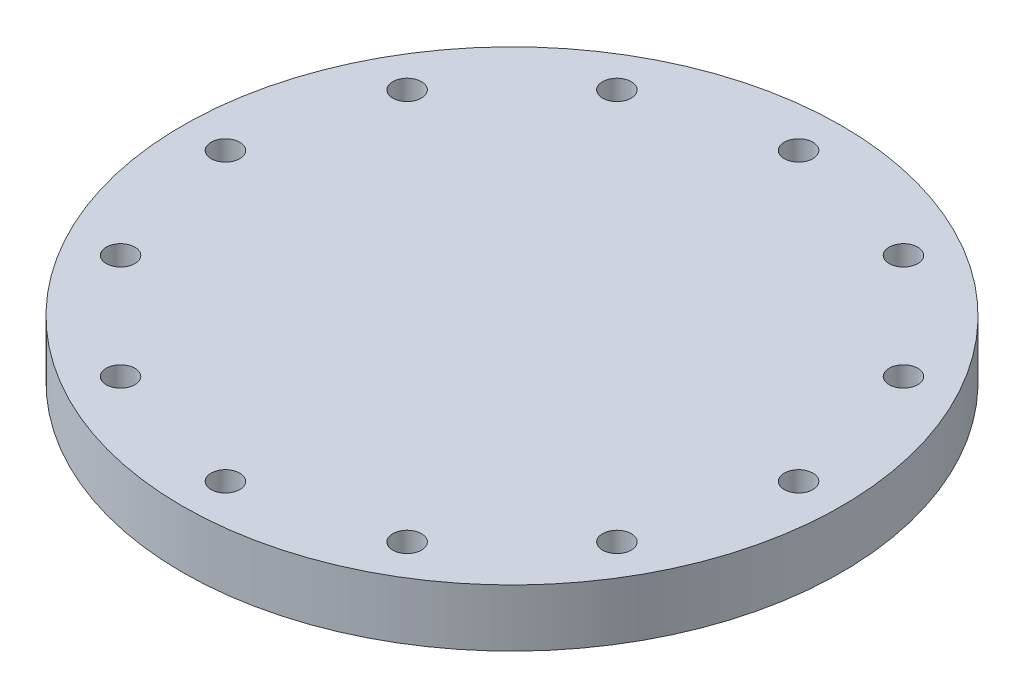
ISO-10303-21;
HEADER;
FILE_DESCRIPTION(('STEP AP214'),'2;1');
FILE_NAME('part.step','',(''),(''),'','','');
FILE_SCHEMA(('AUTOMOTIVE_DESIGN { 1 0 10303 214 1 1 1 1 }'));
ENDSEC;
DATA;
#1=APPLICATION_CONTEXT('core data for automotive mechanical design processes');
#2=APPLICATION_PROTOCOL_DEFINITION('international standard','automotive_design',2000,#1);
#3=PRODUCT_CONTEXT('',#1,'mechanical');
#4=PRODUCT('Part','Part','',(#3));
#5=PRODUCT_RELATED_PRODUCT_CATEGORY('part','',(#4));
#6=PRODUCT_DEFINITION_FORMATION('','',#4);
#7=PRODUCT_DEFINITION_CONTEXT('part definition',#1,'design');
#8=PRODUCT_DEFINITION('design','',#6,#7);
#9=PRODUCT_DEFINITION_SHAPE('','',#8);
#10=(LENGTH_UNIT() NAMED_UNIT(*) SI_UNIT(.MILLI.,.METRE.));
#11=(NAMED_UNIT(*) PLANE_ANGLE_UNIT() SI_UNIT($,.RADIAN.));
#12=(NAMED_UNIT(*) SI_UNIT($,.STERADIAN.) SOLID_ANGLE_UNIT());
#13=UNCERTAINTY_MEASURE_WITH_UNIT(LENGTH_MEASURE(1.E-05),#10,'distance_accuracy_value','');
#14=(GEOMETRIC_REPRESENTATION_CONTEXT(3) GLOBAL_UNCERTAINTY_ASSIGNED_CONTEXT((#13)) GLOBAL_UNIT_ASSIGNED_CONTEXT((#10,
#11,#12)) REPRESENTATION_CONTEXT('',''));
#15=CARTESIAN_POINT('',(0.,0.,0.));
#16=DIRECTION('',(0.,0.,1.));
#17=DIRECTION('',(1.,0.,0.));
#18=AXIS2_PLACEMENT_3D('',#15,#16,#17);
#19=CARTESIAN_POINT('',(0.,20.,0.));
#20=DIRECTION('',(0.,-1.,0.));
#21=DIRECTION('',(0.,0.,-1.));
#22=AXIS2_PLACEMENT_3D('',#19,#20,#21);
#23=CYLINDRICAL_SURFACE('',#22,115.);
#24=CARTESIAN_POINT('',(0.,20.,0.));
#25=DIRECTION('',(0.,1.,0.));
#26=DIRECTION('',(0.,0.,1.));
#27=AXIS2_PLACEMENT_3D('',#24,#25,#26);
#28=CIRCLE('',#27,115.);
#29=CARTESIAN_POINT('',(0.,20.,115.));
#30=VERTEX_POINT('',#29);
#31=EDGE_CURVE('E10',#30,#30,#28,.T.);
#32=ORIENTED_EDGE('',*,*,#31,.F.);
#33=EDGE_LOOP('',(#32));
#34=FACE_BOUND('',#33,.T.);
#35=CARTESIAN_POINT('',(0.,0.,0.));
#36=DIRECTION('',(0.,1.,0.));
#37=DIRECTION('',(0.,0.,1.));
#38=AXIS2_PLACEMENT_3D('',#35,#36,#37);
#39=CIRCLE('',#38,115.);
#40=CARTESIAN_POINT('',(0.,0.,115.));
#41=VERTEX_POINT('',#40);
#42=EDGE_CURVE('E40',#41,#41,#39,.T.);
#43=ORIENTED_EDGE('',*,*,#42,.T.);
#44=EDGE_LOOP('',(#43));
#45=FACE_BOUND('',#44,.T.);
#46=ADVANCED_FACE('F37',(#34,#45),#23,.T.);
#47=CARTESIAN_POINT('',(0.,20.,0.));
#48=DIRECTION('',(0.,1.,0.));
#49=DIRECTION('',(0.,0.,1.));
#50=AXIS2_PLACEMENT_3D('',#47,#48,#49);
#51=PLANE('',#50);
#52=CARTESIAN_POINT('',(0.,20.,-100.));
#53=DIRECTION('',(0.,1.,0.));
#54=DIRECTION('',(0.,0.,1.));
#55=AXIS2_PLACEMENT_3D('',#52,#53,#54);
#56=CIRCLE('',#55,5.);
#57=CARTESIAN_POINT('',(0.,20.,-95.));
#58=VERTEX_POINT('',#57);
#59=EDGE_CURVE('E81',#58,#58,#56,.T.);
#60=ORIENTED_EDGE('',*,*,#59,.F.);
#61=EDGE_LOOP('',(#60));
#62=FACE_BOUND('',#61,.T.);
#63=CARTESIAN_POINT('',(-49.9999999999995,20.,-86.6025403784416));
#64=DIRECTION('',(0.,1.,0.));
#65=DIRECTION('',(0.,0.,1.));
#66=AXIS2_PLACEMENT_3D('',#63,#64,#65);
#67=CIRCLE('',#66,5.);
#68=CARTESIAN_POINT('',(-49.9999999999995,20.,-81.6025403784416));
#69=VERTEX_POINT('',#68);
#70=EDGE_CURVE('E122',#69,#69,#67,.T.);
#71=ORIENTED_EDGE('',*,*,#70,.F.);
#72=EDGE_LOOP('',(#71));
#73=FACE_BOUND('',#72,.T.);
#74=CARTESIAN_POINT('',(-86.6025403784417,20.,-49.9999999999961));
#75=DIRECTION('',(0.,1.,0.));
#76=DIRECTION('',(0.,0.,1.));
#77=AXIS2_PLACEMENT_3D('',#74,#75,#76);
#78=CIRCLE('',#77,5.00000000000001);
#79=CARTESIAN_POINT('',(-86.6025403784417,20.,-44.9999999999961));
#80=VERTEX_POINT('',#79);
#81=EDGE_CURVE('E121',#80,#80,#78,.T.);
#82=ORIENTED_EDGE('',*,*,#81,.F.);
#83=EDGE_LOOP('',(#82));
#84=FACE_BOUND('',#83,.T.);
#85=CARTESIAN_POINT('',(-99.9999999999956,20.,4.47550075018927E-12));
#86=DIRECTION('',(0.,1.,0.));
#87=DIRECTION('',(0.,0.,1.));
#88=AXIS2_PLACEMENT_3D('',#85,#86,#87);
#89=CIRCLE('',#88,5.);
#90=CARTESIAN_POINT('',(-99.9999999999956,20.,5.00000000000448));
#91=VERTEX_POINT('',#90);
#92=EDGE_CURVE('E130',#91,#91,#89,.T.);
#93=ORIENTED_EDGE('',*,*,#92,.F.);
#94=EDGE_LOOP('',(#93));
#95=FACE_BOUND('',#94,.T.);
#96=CARTESIAN_POINT('',(50.0000000000006,20.,-86.6025403784461));
#97=DIRECTION('',(0.,1.,0.));
#98=DIRECTION('',(0.,0.,1.));
#99=AXIS2_PLACEMENT_3D('',#96,#97,#98);
#100=CIRCLE('',#99,5.);
#101=CARTESIAN_POINT('',(50.0000000000006,20.,-81.6025403784461));
#102=VERTEX_POINT('',#101);
#103=EDGE_CURVE('E73',#102,#102,#100,.T.);
#104=ORIENTED_EDGE('',*,*,#103,.F.);
#105=EDGE_LOOP('',(#104));
#106=FACE_BOUND('',#105,.T.);
#107=CARTESIAN_POINT('',(86.6025403784461,20.,-50.0000000000039));
#108=DIRECTION('',(0.,1.,0.));
#109=DIRECTION('',(0.,0.,1.));
#110=AXIS2_PLACEMENT_3D('',#107,#108,#109);
#111=CIRCLE('',#110,5.00000000000001);
#112=CARTESIAN_POINT('',(86.6025403784461,20.,-45.0000000000039));
#113=VERTEX_POINT('',#112);
#114=EDGE_CURVE('E65',#113,#113,#111,.T.);
#115=ORIENTED_EDGE('',*,*,#114,.F.);
#116=EDGE_LOOP('',(#115));
#117=FACE_BOUND('',#116,.T.);
#118=CARTESIAN_POINT('',(100.000000000004,20.,-4.4632542821978E-12));
#119=DIRECTION('',(0.,1.,0.));
#120=DIRECTION('',(0.,0.,1.));
#121=AXIS2_PLACEMENT_3D('',#118,#119,#120);
#122=CIRCLE('',#121,5.);
#123=CARTESIAN_POINT('',(100.000000000004,20.,4.99999999999554));
#124=VERTEX_POINT('',#123);
#125=EDGE_CURVE('E55',#124,#124,#122,.T.);
#126=ORIENTED_EDGE('',*,*,#125,.F.);
#127=EDGE_LOOP('',(#126));
#128=FACE_BOUND('',#127,.T.);
#129=CARTESIAN_POINT('',(86.6025403784506,20.,49.9999999999961));
#130=DIRECTION('',(0.,1.,0.));
#131=DIRECTION('',(0.,0.,1.));
#132=AXIS2_PLACEMENT_3D('',#129,#130,#131);
#133=CIRCLE('',#132,5.00000000000001);
#134=CARTESIAN_POINT('',(86.6025403784506,20.,54.9999999999961));
#135=VERTEX_POINT('',#134);
#136=EDGE_CURVE('E56',#135,#135,#133,.T.);
#137=ORIENTED_EDGE('',*,*,#136,.F.);
#138=EDGE_LOOP('',(#137));
#139=FACE_BOUND('',#138,.T.);
#140=CARTESIAN_POINT('',(50.0000000000083,20.,86.6025403784416));
#141=DIRECTION('',(0.,1.,0.));
#142=DIRECTION('',(0.,0.,1.));
#143=AXIS2_PLACEMENT_3D('',#140,#141,#142);
#144=CIRCLE('',#143,5.);
#145=CARTESIAN_POINT('',(50.0000000000083,20.,91.6025403784416));
#146=VERTEX_POINT('',#145);
#147=EDGE_CURVE('E107',#146,#146,#144,.T.);
#148=ORIENTED_EDGE('',*,*,#147,.F.);
#149=EDGE_LOOP('',(#148));
#150=FACE_BOUND('',#149,.T.);
#151=CARTESIAN_POINT('',(8.92650856439559E-12,20.,100.));
#152=DIRECTION('',(0.,1.,0.));
#153=DIRECTION('',(0.,0.,1.));
#154=AXIS2_PLACEMENT_3D('',#151,#152,#153);
#155=CIRCLE('',#154,5.);
#156=CARTESIAN_POINT('',(8.92650856439559E-12,20.,105.));
#157=VERTEX_POINT('',#156);
#158=EDGE_CURVE('E99',#157,#157,#155,.T.);
#159=ORIENTED_EDGE('',*,*,#158,.F.);
#160=EDGE_LOOP('',(#159));
#161=FACE_BOUND('',#160,.T.);
#162=CARTESIAN_POINT('',(-49.9999999999917,20.,86.6025403784461));
#163=DIRECTION('',(0.,1.,0.));
#164=DIRECTION('',(0.,0.,1.));
#165=AXIS2_PLACEMENT_3D('',#162,#163,#164);
#166=CIRCLE('',#165,5.);
#167=CARTESIAN_POINT('',(-49.9999999999917,20.,91.6025403784461));
#168=VERTEX_POINT('',#167);
#169=EDGE_CURVE('E89',#168,#168,#166,.T.);
#170=ORIENTED_EDGE('',*,*,#169,.F.);
#171=EDGE_LOOP('',(#170));
#172=FACE_BOUND('',#171,.T.);
#173=CARTESIAN_POINT('',(-86.6025403784372,20.,50.0000000000039));
#174=DIRECTION('',(0.,1.,0.));
#175=DIRECTION('',(0.,0.,1.));
#176=AXIS2_PLACEMENT_3D('',#173,#174,#175);
#177=CIRCLE('',#176,5.00000000000001);
#178=CARTESIAN_POINT('',(-86.6025403784372,20.,55.0000000000039));
#179=VERTEX_POINT('',#178);
#180=EDGE_CURVE('E90',#179,#179,#177,.T.);
#181=ORIENTED_EDGE('',*,*,#180,.F.);
#182=EDGE_LOOP('',(#181));
#183=FACE_BOUND('',#182,.T.);
#184=ORIENTED_EDGE('',*,*,#31,.T.);
#185=EDGE_LOOP('',(#184));
#186=FACE_BOUND('',#185,.T.);
#187=ADVANCED_FACE('F150',(#62,#73,#84,#95,#106,#117,#128,#139,#150,#161,#172,#183,#186),#51,.T.);
#188=CARTESIAN_POINT('',(0.,0.,0.));
#189=DIRECTION('',(0.,1.,0.));
#190=DIRECTION('',(0.,0.,1.));
#191=AXIS2_PLACEMENT_3D('',#188,#189,#190);
#192=PLANE('',#191);
#193=CARTESIAN_POINT('',(0.,0.,-100.));
#194=DIRECTION('',(0.,1.,0.));
#195=DIRECTION('',(0.,0.,1.));
#196=AXIS2_PLACEMENT_3D('',#193,#194,#195);
#197=CIRCLE('',#196,5.);
#198=CARTESIAN_POINT('',(0.,0.,-95.));
#199=VERTEX_POINT('',#198);
#200=EDGE_CURVE('E49',#199,#199,#197,.F.);
#201=ORIENTED_EDGE('',*,*,#200,.F.);
#202=EDGE_LOOP('',(#201));
#203=FACE_BOUND('',#202,.T.);
#204=CARTESIAN_POINT('',(-49.9999999999995,0.,-86.6025403784416));
#205=DIRECTION('',(0.,1.,0.));
#206=DIRECTION('',(0.,0.,1.));
#207=AXIS2_PLACEMENT_3D('',#204,#205,#206);
#208=CIRCLE('',#207,5.);
#209=CARTESIAN_POINT('',(-49.9999999999995,0.,-81.6025403784416));
#210=VERTEX_POINT('',#209);
#211=EDGE_CURVE('E117',#210,#210,#208,.F.);
#212=ORIENTED_EDGE('',*,*,#211,.F.);
#213=EDGE_LOOP('',(#212));
#214=FACE_BOUND('',#213,.T.);
#215=CARTESIAN_POINT('',(-86.6025403784417,0.,-49.9999999999961));
#216=DIRECTION('',(0.,1.,0.));
#217=DIRECTION('',(0.,0.,1.));
#218=AXIS2_PLACEMENT_3D('',#215,#216,#217);
#219=CIRCLE('',#218,5.00000000000001);
#220=CARTESIAN_POINT('',(-86.6025403784417,0.,-44.9999999999961));
#221=VERTEX_POINT('',#220);
#222=EDGE_CURVE('E126',#221,#221,#219,.F.);
#223=ORIENTED_EDGE('',*,*,#222,.F.);
#224=EDGE_LOOP('',(#223));
#225=FACE_BOUND('',#224,.T.);
#226=CARTESIAN_POINT('',(-99.9999999999956,0.,4.47550075018927E-12));
#227=DIRECTION('',(0.,1.,0.));
#228=DIRECTION('',(0.,0.,1.));
#229=AXIS2_PLACEMENT_3D('',#226,#227,#228);
#230=CIRCLE('',#229,5.);
#231=CARTESIAN_POINT('',(-99.9999999999956,0.,5.00000000000448));
#232=VERTEX_POINT('',#231);
#233=EDGE_CURVE('E94',#232,#232,#230,.F.);
#234=ORIENTED_EDGE('',*,*,#233,.F.);
#235=EDGE_LOOP('',(#234));
#236=FACE_BOUND('',#235,.T.);
#237=CARTESIAN_POINT('',(50.0000000000006,0.,-86.6025403784461));
#238=DIRECTION('',(0.,1.,0.));
#239=DIRECTION('',(0.,0.,1.));
#240=AXIS2_PLACEMENT_3D('',#237,#238,#239);
#241=CIRCLE('',#240,5.);
#242=CARTESIAN_POINT('',(50.0000000000006,0.,-81.6025403784461));
#243=VERTEX_POINT('',#242);
#244=EDGE_CURVE('E77',#243,#243,#241,.F.);
#245=ORIENTED_EDGE('',*,*,#244,.F.);
#246=EDGE_LOOP('',(#245));
#247=FACE_BOUND('',#246,.T.);
#248=CARTESIAN_POINT('',(86.6025403784461,0.,-50.0000000000039));
#249=DIRECTION('',(0.,1.,0.));
#250=DIRECTION('',(0.,0.,1.));
#251=AXIS2_PLACEMENT_3D('',#248,#249,#250);
#252=CIRCLE('',#251,5.00000000000001);
#253=CARTESIAN_POINT('',(86.6025403784461,0.,-45.0000000000039));
#254=VERTEX_POINT('',#253);
#255=EDGE_CURVE('E69',#254,#254,#252,.F.);
#256=ORIENTED_EDGE('',*,*,#255,.F.);
#257=EDGE_LOOP('',(#256));
#258=FACE_BOUND('',#257,.T.);
#259=CARTESIAN_POINT('',(100.000000000004,0.,-4.4632542821978E-12));
#260=DIRECTION('',(0.,1.,0.));
#261=DIRECTION('',(0.,0.,1.));
#262=AXIS2_PLACEMENT_3D('',#259,#260,#261);
#263=CIRCLE('',#262,5.);
#264=CARTESIAN_POINT('',(100.000000000004,0.,4.99999999999554));
#265=VERTEX_POINT('',#264);
#266=EDGE_CURVE('E61',#265,#265,#263,.F.);
#267=ORIENTED_EDGE('',*,*,#266,.F.);
#268=EDGE_LOOP('',(#267));
#269=FACE_BOUND('',#268,.T.);
#270=CARTESIAN_POINT('',(86.6025403784506,0.,49.9999999999961));
#271=DIRECTION('',(0.,1.,0.));
#272=DIRECTION('',(0.,0.,1.));
#273=AXIS2_PLACEMENT_3D('',#270,#271,#272);
#274=CIRCLE('',#273,5.00000000000001);
#275=CARTESIAN_POINT('',(86.6025403784506,0.,54.9999999999961));
#276=VERTEX_POINT('',#275);
#277=EDGE_CURVE('E51',#276,#276,#274,.F.);
#278=ORIENTED_EDGE('',*,*,#277,.F.);
#279=EDGE_LOOP('',(#278));
#280=FACE_BOUND('',#279,.T.);
#281=CARTESIAN_POINT('',(50.0000000000083,0.,86.6025403784416));
#282=DIRECTION('',(0.,1.,0.));
#283=DIRECTION('',(0.,0.,1.));
#284=AXIS2_PLACEMENT_3D('',#281,#282,#283);
#285=CIRCLE('',#284,5.);
#286=CARTESIAN_POINT('',(50.0000000000083,0.,91.6025403784416));
#287=VERTEX_POINT('',#286);
#288=EDGE_CURVE('E60',#287,#287,#285,.F.);
#289=ORIENTED_EDGE('',*,*,#288,.F.);
#290=EDGE_LOOP('',(#289));
#291=FACE_BOUND('',#290,.T.);
#292=CARTESIAN_POINT('',(8.92650856439559E-12,0.,100.));
#293=DIRECTION('',(0.,1.,0.));
#294=DIRECTION('',(0.,0.,1.));
#295=AXIS2_PLACEMENT_3D('',#292,#293,#294);
#296=CIRCLE('',#295,5.);
#297=CARTESIAN_POINT('',(8.92650856439559E-12,0.,105.));
#298=VERTEX_POINT('',#297);
#299=EDGE_CURVE('E103',#298,#298,#296,.F.);
#300=ORIENTED_EDGE('',*,*,#299,.F.);
#301=EDGE_LOOP('',(#300));
#302=FACE_BOUND('',#301,.T.);
#303=CARTESIAN_POINT('',(-49.9999999999917,0.,86.6025403784461));
#304=DIRECTION('',(0.,1.,0.));
#305=DIRECTION('',(0.,0.,1.));
#306=AXIS2_PLACEMENT_3D('',#303,#304,#305);
#307=CIRCLE('',#306,5.);
#308=CARTESIAN_POINT('',(-49.9999999999917,0.,91.6025403784461));
#309=VERTEX_POINT('',#308);
#310=EDGE_CURVE('E95',#309,#309,#307,.F.);
#311=ORIENTED_EDGE('',*,*,#310,.F.);
#312=EDGE_LOOP('',(#311));
#313=FACE_BOUND('',#312,.T.);
#314=CARTESIAN_POINT('',(-86.6025403784372,0.,50.0000000000039));
#315=DIRECTION('',(0.,1.,0.));
#316=DIRECTION('',(0.,0.,1.));
#317=AXIS2_PLACEMENT_3D('',#314,#315,#316);
#318=CIRCLE('',#317,5.00000000000001);
#319=CARTESIAN_POINT('',(-86.6025403784372,0.,55.0000000000039));
#320=VERTEX_POINT('',#319);
#321=EDGE_CURVE('E85',#320,#320,#318,.F.);
#322=ORIENTED_EDGE('',*,*,#321,.F.);
#323=EDGE_LOOP('',(#322));
#324=FACE_BOUND('',#323,.T.);
#325=ORIENTED_EDGE('',*,*,#42,.F.);
#326=EDGE_LOOP('',(#325));
#327=FACE_BOUND('',#326,.T.);
#328=ADVANCED_FACE('F153',(#203,#214,#225,#236,#247,#258,#269,#280,#291,#302,#313,#324,#327),
#192,.F.);
#329=CARTESIAN_POINT('',(-86.6025403784372,-0.001000000000001,50.0000000000039));
#330=DIRECTION('',(0.,1.,0.));
#331=DIRECTION('',(0.,0.,1.));
#332=AXIS2_PLACEMENT_3D('',#329,#330,#331);
#333=CYLINDRICAL_SURFACE('',#332,5.00000000000001);
#334=ORIENTED_EDGE('',*,*,#180,.T.);
#335=EDGE_LOOP('',(#334));
#336=FACE_BOUND('',#335,.T.);
#337=ORIENTED_EDGE('',*,*,#321,.T.);
#338=EDGE_LOOP('',(#337));
#339=FACE_BOUND('',#338,.T.);
#340=ADVANCED_FACE('F177',(#336,#339),#333,.F.);
#341=CARTESIAN_POINT('',(-49.9999999999917,-0.001000000000001,86.6025403784461));
#342=DIRECTION('',(0.,1.,0.));
#343=DIRECTION('',(0.,0.,1.));
#344=AXIS2_PLACEMENT_3D('',#341,#342,#343);
#345=CYLINDRICAL_SURFACE('',#344,5.);
#346=ORIENTED_EDGE('',*,*,#169,.T.);
#347=EDGE_LOOP('',(#346));
#348=FACE_BOUND('',#347,.T.);
#349=ORIENTED_EDGE('',*,*,#310,.T.);
#350=EDGE_LOOP('',(#349));
#351=FACE_BOUND('',#350,.T.);
#352=ADVANCED_FACE('F180',(#348,#351),#345,.F.);
#353=CARTESIAN_POINT('',(8.92650856439559E-12,-0.001000000000001,100.));
#354=DIRECTION('',(0.,1.,0.));
#355=DIRECTION('',(0.,0.,1.));
#356=AXIS2_PLACEMENT_3D('',#353,#354,#355);
#357=CYLINDRICAL_SURFACE('',#356,5.);
#358=ORIENTED_EDGE('',*,*,#158,.T.);
#359=EDGE_LOOP('',(#358));
#360=FACE_BOUND('',#359,.T.);
#361=ORIENTED_EDGE('',*,*,#299,.T.);
#362=EDGE_LOOP('',(#361));
#363=FACE_BOUND('',#362,.T.);
#364=ADVANCED_FACE('F211',(#360,#363),#357,.F.);
#365=CARTESIAN_POINT('',(50.0000000000083,-0.001000000000001,86.6025403784416));
#366=DIRECTION('',(0.,1.,0.));
#367=DIRECTION('',(0.,0.,1.));
#368=AXIS2_PLACEMENT_3D('',#365,#366,#367);
#369=CYLINDRICAL_SURFACE('',#368,5.);
#370=ORIENTED_EDGE('',*,*,#147,.T.);
#371=EDGE_LOOP('',(#370));
#372=FACE_BOUND('',#371,.T.);
#373=ORIENTED_EDGE('',*,*,#288,.T.);
#374=EDGE_LOOP('',(#373));
#375=FACE_BOUND('',#374,.T.);
#376=ADVANCED_FACE('F219',(#372,#375),#369,.F.);
#377=CARTESIAN_POINT('',(86.6025403784506,-0.001000000000001,49.9999999999961));
#378=DIRECTION('',(0.,1.,0.));
#379=DIRECTION('',(0.,0.,1.));
#380=AXIS2_PLACEMENT_3D('',#377,#378,#379);
#381=CYLINDRICAL_SURFACE('',#380,5.00000000000001);
#382=ORIENTED_EDGE('',*,*,#136,.T.);
#383=EDGE_LOOP('',(#382));
#384=FACE_BOUND('',#383,.T.);
#385=ORIENTED_EDGE('',*,*,#277,.T.);
#386=EDGE_LOOP('',(#385));
#387=FACE_BOUND('',#386,.T.);
#388=ADVANCED_FACE('F227',(#384,#387),#381,.F.);
#389=CARTESIAN_POINT('',(100.000000000004,-0.001000000000001,-4.4632542821978E-12));
#390=DIRECTION('',(0.,1.,0.));
#391=DIRECTION('',(0.,0.,1.));
#392=AXIS2_PLACEMENT_3D('',#389,#390,#391);
#393=CYLINDRICAL_SURFACE('',#392,5.);
#394=ORIENTED_EDGE('',*,*,#125,.T.);
#395=EDGE_LOOP('',(#394));
#396=FACE_BOUND('',#395,.T.);
#397=ORIENTED_EDGE('',*,*,#266,.T.);
#398=EDGE_LOOP('',(#397));
#399=FACE_BOUND('',#398,.T.);
#400=ADVANCED_FACE('F235',(#396,#399),#393,.F.);
#401=CARTESIAN_POINT('',(86.6025403784461,-0.001000000000001,-50.0000000000039));
#402=DIRECTION('',(0.,1.,0.));
#403=DIRECTION('',(0.,0.,1.));
#404=AXIS2_PLACEMENT_3D('',#401,#402,#403);
#405=CYLINDRICAL_SURFACE('',#404,5.00000000000001);
#406=ORIENTED_EDGE('',*,*,#114,.T.);
#407=EDGE_LOOP('',(#406));
#408=FACE_BOUND('',#407,.T.);
#409=ORIENTED_EDGE('',*,*,#255,.T.);
#410=EDGE_LOOP('',(#409));
#411=FACE_BOUND('',#410,.T.);
#412=ADVANCED_FACE('F243',(#408,#411),#405,.F.);
#413=CARTESIAN_POINT('',(50.0000000000006,-0.001000000000001,-86.6025403784461));
#414=DIRECTION('',(0.,1.,0.));
#415=DIRECTION('',(0.,0.,1.));
#416=AXIS2_PLACEMENT_3D('',#413,#414,#415);
#417=CYLINDRICAL_SURFACE('',#416,5.);
#418=ORIENTED_EDGE('',*,*,#103,.T.);
#419=EDGE_LOOP('',(#418));
#420=FACE_BOUND('',#419,.T.);
#421=ORIENTED_EDGE('',*,*,#244,.T.);
#422=EDGE_LOOP('',(#421));
#423=FACE_BOUND('',#422,.T.);
#424=ADVANCED_FACE('F251',(#420,#423),#417,.F.);
#425=CARTESIAN_POINT('',(-99.9999999999956,-0.001000000000001,4.47550075018927E-12));
#426=DIRECTION('',(0.,1.,0.));
#427=DIRECTION('',(0.,0.,1.));
#428=AXIS2_PLACEMENT_3D('',#425,#426,#427);
#429=CYLINDRICAL_SURFACE('',#428,5.);
#430=ORIENTED_EDGE('',*,*,#92,.T.);
#431=EDGE_LOOP('',(#430));
#432=FACE_BOUND('',#431,.T.);
#433=ORIENTED_EDGE('',*,*,#233,.T.);
#434=EDGE_LOOP('',(#433));
#435=FACE_BOUND('',#434,.T.);
#436=ADVANCED_FACE('F259',(#432,#435),#429,.F.);
#437=CARTESIAN_POINT('',(-86.6025403784417,-0.001000000000001,-49.9999999999961));
#438=DIRECTION('',(0.,1.,0.));
#439=DIRECTION('',(0.,0.,1.));
#440=AXIS2_PLACEMENT_3D('',#437,#438,#439);
#441=CYLINDRICAL_SURFACE('',#440,5.00000000000001);
#442=ORIENTED_EDGE('',*,*,#81,.T.);
#443=EDGE_LOOP('',(#442));
#444=FACE_BOUND('',#443,.T.);
#445=ORIENTED_EDGE('',*,*,#222,.T.);
#446=EDGE_LOOP('',(#445));
#447=FACE_BOUND('',#446,.T.);
#448=ADVANCED_FACE('F267',(#444,#447),#441,.F.);
#449=CARTESIAN_POINT('',(-49.9999999999995,-0.001000000000001,-86.6025403784416));
#450=DIRECTION('',(0.,1.,0.));
#451=DIRECTION('',(0.,0.,1.));
#452=AXIS2_PLACEMENT_3D('',#449,#450,#451);
#453=CYLINDRICAL_SURFACE('',#452,5.);
#454=ORIENTED_EDGE('',*,*,#70,.T.);
#455=EDGE_LOOP('',(#454));
#456=FACE_BOUND('',#455,.T.);
#457=ORIENTED_EDGE('',*,*,#211,.T.);
#458=EDGE_LOOP('',(#457));
#459=FACE_BOUND('',#458,.T.);
#460=ADVANCED_FACE('F275',(#456,#459),#453,.F.);
#461=CARTESIAN_POINT('',(0.,-0.001000000000001,-100.));
#462=DIRECTION('',(0.,1.,0.));
#463=DIRECTION('',(0.,0.,1.));
#464=AXIS2_PLACEMENT_3D('',#461,#462,#463);
#465=CYLINDRICAL_SURFACE('',#464,5.);
#466=ORIENTED_EDGE('',*,*,#59,.T.);
#467=EDGE_LOOP('',(#466));
#468=FACE_BOUND('',#467,.T.);
#469=ORIENTED_EDGE('',*,*,#200,.T.);
#470=EDGE_LOOP('',(#469));
#471=FACE_BOUND('',#470,.T.);
#472=ADVANCED_FACE('F147',(#468,#471),#465,.F.);
#473=CLOSED_SHELL('',(#46,#187,#328,#340,#352,#364,#376,#388,#400,#412,#424,#436,#448,#460,#472));
#474=MANIFOLD_SOLID_BREP('B2',#473);
#475=ADVANCED_BREP_SHAPE_REPRESENTATION('',(#18,#474),#14);
#476=SHAPE_DEFINITION_REPRESENTATION(#9,#475);
ENDSEC;
END-ISO-10303-21;
